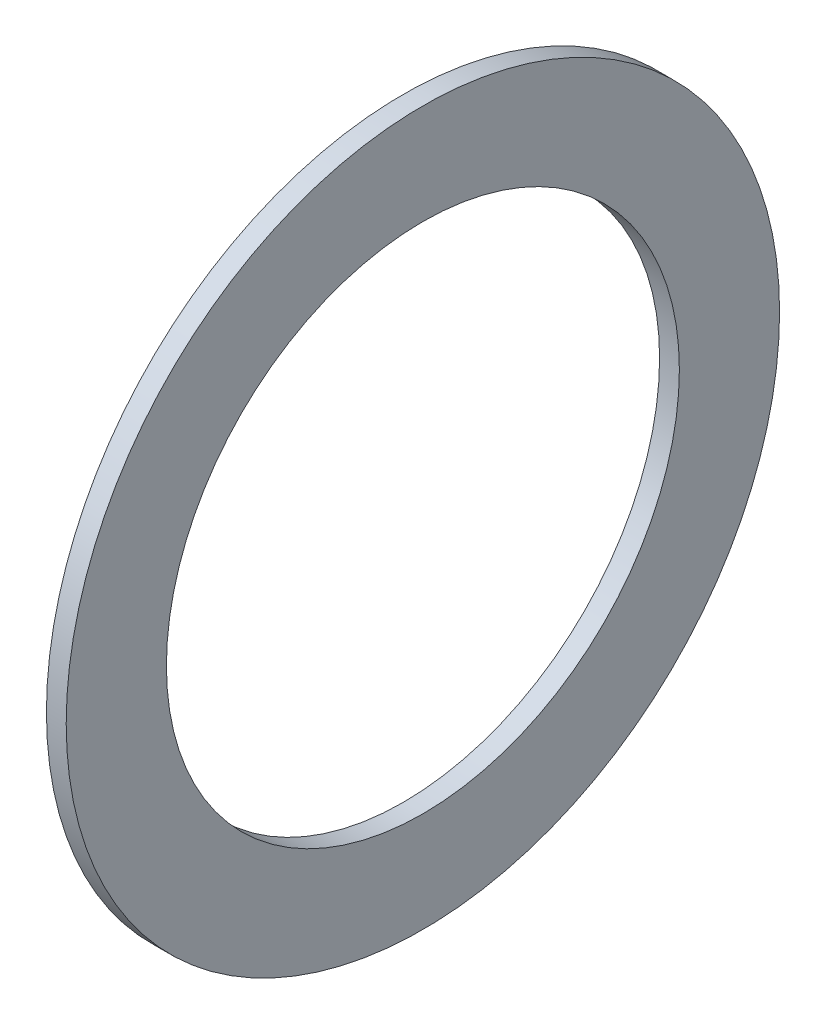
ISO-10303-21;
HEADER;
FILE_DESCRIPTION(('STEP AP214'),'2;1');
FILE_NAME('part.step','',(''),(''),'','','');
FILE_SCHEMA(('AUTOMOTIVE_DESIGN { 1 0 10303 214 1 1 1 1 }'));
ENDSEC;
DATA;
#1=APPLICATION_CONTEXT('core data for automotive mechanical design processes');
#2=APPLICATION_PROTOCOL_DEFINITION('international standard','automotive_design',2000,#1);
#3=PRODUCT_CONTEXT('',#1,'mechanical');
#4=PRODUCT('Part','Part','',(#3));
#5=PRODUCT_RELATED_PRODUCT_CATEGORY('part','',(#4));
#6=PRODUCT_DEFINITION_FORMATION('','',#4);
#7=PRODUCT_DEFINITION_CONTEXT('part definition',#1,'design');
#8=PRODUCT_DEFINITION('design','',#6,#7);
#9=PRODUCT_DEFINITION_SHAPE('','',#8);
#10=(LENGTH_UNIT() NAMED_UNIT(*) SI_UNIT(.MILLI.,.METRE.));
#11=(NAMED_UNIT(*) PLANE_ANGLE_UNIT() SI_UNIT($,.RADIAN.));
#12=(NAMED_UNIT(*) SI_UNIT($,.STERADIAN.) SOLID_ANGLE_UNIT());
#13=UNCERTAINTY_MEASURE_WITH_UNIT(LENGTH_MEASURE(1.E-05),#10,'distance_accuracy_value','');
#14=(GEOMETRIC_REPRESENTATION_CONTEXT(3) GLOBAL_UNCERTAINTY_ASSIGNED_CONTEXT((#13)) GLOBAL_UNIT_ASSIGNED_CONTEXT((#10,
#11,#12)) REPRESENTATION_CONTEXT('',''));
#15=CARTESIAN_POINT('',(0.,0.,0.));
#16=DIRECTION('',(0.,0.,1.));
#17=DIRECTION('',(1.,0.,0.));
#18=AXIS2_PLACEMENT_3D('',#15,#16,#17);
#19=CARTESIAN_POINT('',(-6.2984315497404,18.3243119350923,0.));
#20=DIRECTION('',(1.,0.,0.));
#21=DIRECTION('',(0.,0.,-1.));
#22=AXIS2_PLACEMENT_3D('',#19,#20,#21);
#23=PLANE('',#22);
#24=CARTESIAN_POINT('',(-6.29843154974034,0.,0.));
#25=DIRECTION('',(1.,0.,0.));
#26=DIRECTION('',(0.,0.,-1.));
#27=AXIS2_PLACEMENT_3D('',#24,#25,#26);
#28=CIRCLE('',#27,13.1764002460031);
#29=CARTESIAN_POINT('',(-6.29843154974034,0.,-13.1764002460031));
#30=VERTEX_POINT('',#29);
#31=EDGE_CURVE('E27',#30,#30,#28,.F.);
#32=ORIENTED_EDGE('',*,*,#31,.T.);
#33=EDGE_LOOP('',(#32));
#34=FACE_BOUND('',#33,.T.);
#35=CARTESIAN_POINT('',(-6.29843154974032,0.,0.));
#36=DIRECTION('',(1.,0.,0.));
#37=DIRECTION('',(0.,0.,-1.));
#38=AXIS2_PLACEMENT_3D('',#35,#36,#37);
#39=CIRCLE('',#38,18.3243119350923);
#40=CARTESIAN_POINT('',(-6.29843154974032,0.,-18.3243119350923));
#41=VERTEX_POINT('',#40);
#42=EDGE_CURVE('E18',#41,#41,#39,.F.);
#43=ORIENTED_EDGE('',*,*,#42,.F.);
#44=EDGE_LOOP('',(#43));
#45=FACE_BOUND('',#44,.T.);
#46=ADVANCED_FACE('F15',(#34,#45),#23,.T.);
#47=CARTESIAN_POINT('',(112.822923356394,0.,0.));
#48=DIRECTION('',(1.,0.,0.));
#49=DIRECTION('',(0.,0.,-1.));
#50=AXIS2_PLACEMENT_3D('',#47,#48,#49);
#51=CYLINDRICAL_SURFACE('',#50,18.3243119350923);
#52=ORIENTED_EDGE('',*,*,#42,.T.);
#53=EDGE_LOOP('',(#52));
#54=FACE_BOUND('',#53,.T.);
#55=CARTESIAN_POINT('',(-7.31443154974026,0.,0.));
#56=DIRECTION('',(1.,0.,0.));
#57=DIRECTION('',(0.,0.,-1.));
#58=AXIS2_PLACEMENT_3D('',#55,#56,#57);
#59=CIRCLE('',#58,18.3243119350923);
#60=CARTESIAN_POINT('',(-7.31443154974026,0.,-18.3243119350923));
#61=VERTEX_POINT('',#60);
#62=EDGE_CURVE('E22',#61,#61,#59,.F.);
#63=ORIENTED_EDGE('',*,*,#62,.F.);
#64=EDGE_LOOP('',(#63));
#65=FACE_BOUND('',#64,.T.);
#66=ADVANCED_FACE('F35',(#54,#65),#51,.T.);
#67=CARTESIAN_POINT('',(112.822923356394,0.,0.));
#68=DIRECTION('',(1.,0.,0.));
#69=DIRECTION('',(0.,0.,-1.));
#70=AXIS2_PLACEMENT_3D('',#67,#68,#69);
#71=CYLINDRICAL_SURFACE('',#70,13.1764002460031);
#72=CARTESIAN_POINT('',(-7.31443154974028,0.,0.));
#73=DIRECTION('',(1.,0.,0.));
#74=DIRECTION('',(0.,0.,-1.));
#75=AXIS2_PLACEMENT_3D('',#72,#73,#74);
#76=CIRCLE('',#75,13.1764002460031);
#77=CARTESIAN_POINT('',(-7.31443154974028,0.,-13.1764002460031));
#78=VERTEX_POINT('',#77);
#79=EDGE_CURVE('E10',#78,#78,#76,.T.);
#80=ORIENTED_EDGE('',*,*,#79,.F.);
#81=EDGE_LOOP('',(#80));
#82=FACE_BOUND('',#81,.T.);
#83=ORIENTED_EDGE('',*,*,#31,.F.);
#84=EDGE_LOOP('',(#83));
#85=FACE_BOUND('',#84,.T.);
#86=ADVANCED_FACE('F43',(#82,#85),#71,.F.);
#87=CARTESIAN_POINT('',(-7.3144315497404,18.3243119350923,0.));
#88=DIRECTION('',(-1.,0.,0.));
#89=DIRECTION('',(0.,0.,1.));
#90=AXIS2_PLACEMENT_3D('',#87,#88,#89);
#91=PLANE('',#90);
#92=ORIENTED_EDGE('',*,*,#79,.T.);
#93=EDGE_LOOP('',(#92));
#94=FACE_BOUND('',#93,.T.);
#95=ORIENTED_EDGE('',*,*,#62,.T.);
#96=EDGE_LOOP('',(#95));
#97=FACE_BOUND('',#96,.T.);
#98=ADVANCED_FACE('F44',(#94,#97),#91,.T.);
#99=CLOSED_SHELL('',(#46,#66,#86,#98));
#100=MANIFOLD_SOLID_BREP('B1',#99);
#101=ADVANCED_BREP_SHAPE_REPRESENTATION('',(#18,#100),#14);
#102=SHAPE_DEFINITION_REPRESENTATION(#9,#101);
ENDSEC;
END-ISO-10303-21;
